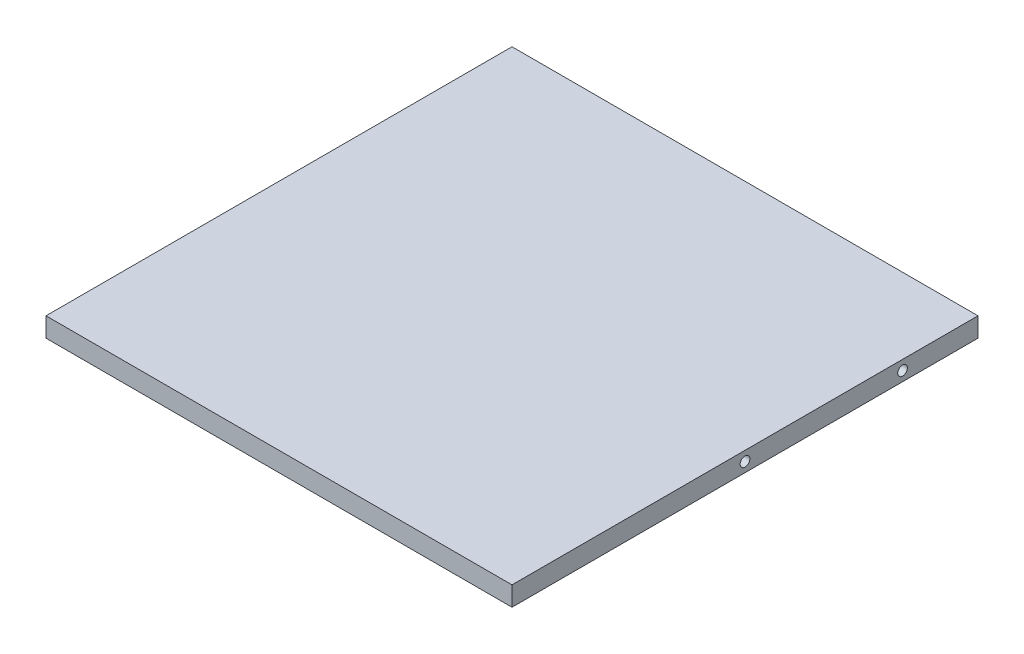
ISO-10303-21;
HEADER;
FILE_DESCRIPTION(('STEP AP214'),'2;1');
FILE_NAME('part.step','',(''),(''),'','','');
FILE_SCHEMA(('AUTOMOTIVE_DESIGN { 1 0 10303 214 1 1 1 1 }'));
ENDSEC;
DATA;
#1=APPLICATION_CONTEXT('core data for automotive mechanical design processes');
#2=APPLICATION_PROTOCOL_DEFINITION('international standard','automotive_design',2000,#1);
#3=PRODUCT_CONTEXT('',#1,'mechanical');
#4=PRODUCT('Part','Part','',(#3));
#5=PRODUCT_RELATED_PRODUCT_CATEGORY('part','',(#4));
#6=PRODUCT_DEFINITION_FORMATION('','',#4);
#7=PRODUCT_DEFINITION_CONTEXT('part definition',#1,'design');
#8=PRODUCT_DEFINITION('design','',#6,#7);
#9=PRODUCT_DEFINITION_SHAPE('','',#8);
#10=(LENGTH_UNIT() NAMED_UNIT(*) SI_UNIT(.MILLI.,.METRE.));
#11=(NAMED_UNIT(*) PLANE_ANGLE_UNIT() SI_UNIT($,.RADIAN.));
#12=(NAMED_UNIT(*) SI_UNIT($,.STERADIAN.) SOLID_ANGLE_UNIT());
#13=UNCERTAINTY_MEASURE_WITH_UNIT(LENGTH_MEASURE(1.E-05),#10,'distance_accuracy_value','');
#14=(GEOMETRIC_REPRESENTATION_CONTEXT(3) GLOBAL_UNCERTAINTY_ASSIGNED_CONTEXT((#13)) GLOBAL_UNIT_ASSIGNED_CONTEXT((#10,
#11,#12)) REPRESENTATION_CONTEXT('',''));
#15=CARTESIAN_POINT('',(0.,0.,0.));
#16=DIRECTION('',(0.,0.,1.));
#17=DIRECTION('',(1.,0.,0.));
#18=AXIS2_PLACEMENT_3D('',#15,#16,#17);
#19=CARTESIAN_POINT('',(-250.84019138756,12.7,-154.952153110048));
#20=DIRECTION('',(1.,0.,0.));
#21=DIRECTION('',(0.,0.,-1.));
#22=AXIS2_PLACEMENT_3D('',#19,#20,#21);
#23=PLANE('',#22);
#24=CARTESIAN_POINT('',(-250.84019138756,6.35,-105.600481839195));
#25=DIRECTION('',(-1.,0.,0.));
#26=DIRECTION('',(0.,0.,1.));
#27=AXIS2_PLACEMENT_3D('',#24,#25,#26);
#28=CIRCLE('',#27,3.175);
#29=CARTESIAN_POINT('',(-250.84019138756,6.35,-102.425481839195));
#30=VERTEX_POINT('',#29);
#31=EDGE_CURVE('E116',#30,#30,#28,.T.);
#32=ORIENTED_EDGE('',*,*,#31,.F.);
#33=EDGE_LOOP('',(#32));
#34=FACE_BOUND('',#33,.T.);
#35=CARTESIAN_POINT('',(-250.84019138756,6.35,-2.55215311004778));
#36=DIRECTION('',(1.,0.,0.));
#37=DIRECTION('',(0.,0.,-1.));
#38=AXIS2_PLACEMENT_3D('',#35,#36,#37);
#39=CIRCLE('',#38,3.175);
#40=CARTESIAN_POINT('',(-250.84019138756,6.35,-5.72715311004778));
#41=VERTEX_POINT('',#40);
#42=EDGE_CURVE('E99',#41,#41,#39,.T.);
#43=ORIENTED_EDGE('',*,*,#42,.T.);
#44=EDGE_LOOP('',(#43));
#45=FACE_BOUND('',#44,.T.);
#46=DIRECTION('',(0.,0.,1.));
#47=VECTOR('',#46,1.);
#48=CARTESIAN_POINT('',(-250.84019138756,0.,-154.952153110048));
#49=LINE('',#48,#47);
#50=CARTESIAN_POINT('',(-250.84019138756,0.,-154.952153110048));
#51=VERTEX_POINT('',#50);
#52=CARTESIAN_POINT('',(-250.84019138756,0.,149.847846889952));
#53=VERTEX_POINT('',#52);
#54=EDGE_CURVE('E96',#51,#53,#49,.T.);
#55=ORIENTED_EDGE('',*,*,#54,.T.);
#56=DIRECTION('',(0.,-1.,0.));
#57=VECTOR('',#56,1.);
#58=CARTESIAN_POINT('',(-250.84019138756,12.7,149.847846889952));
#59=LINE('',#58,#57);
#60=CARTESIAN_POINT('',(-250.84019138756,12.7,149.847846889952));
#61=VERTEX_POINT('',#60);
#62=EDGE_CURVE('E11',#61,#53,#59,.T.);
#63=ORIENTED_EDGE('',*,*,#62,.F.);
#64=DIRECTION('',(0.,0.,1.));
#65=VECTOR('',#64,1.);
#66=CARTESIAN_POINT('',(-250.84019138756,12.7,-154.952153110048));
#67=LINE('',#66,#65);
#68=CARTESIAN_POINT('',(-250.84019138756,12.7,-154.952153110048));
#69=VERTEX_POINT('',#68);
#70=EDGE_CURVE('E84',#69,#61,#67,.T.);
#71=ORIENTED_EDGE('',*,*,#70,.F.);
#72=DIRECTION('',(0.,-1.,0.));
#73=VECTOR('',#72,1.);
#74=CARTESIAN_POINT('',(-250.84019138756,12.7,-154.952153110048));
#75=LINE('',#74,#73);
#76=EDGE_CURVE('E92',#69,#51,#75,.T.);
#77=ORIENTED_EDGE('',*,*,#76,.T.);
#78=EDGE_LOOP('',(#55,#63,#71,#77));
#79=FACE_BOUND('',#78,.T.);
#80=ADVANCED_FACE('F33',(#34,#45,#79),#23,.F.);
#81=CARTESIAN_POINT('',(-250.84019138756,12.7,149.847846889952));
#82=DIRECTION('',(0.,0.,-1.));
#83=DIRECTION('',(-1.,0.,0.));
#84=AXIS2_PLACEMENT_3D('',#81,#82,#83);
#85=PLANE('',#84);
#86=DIRECTION('',(1.,0.,0.));
#87=VECTOR('',#86,1.);
#88=CARTESIAN_POINT('',(-250.84019138756,0.,149.847846889952));
#89=LINE('',#88,#87);
#90=CARTESIAN_POINT('',(53.9598086124403,0.,149.847846889952));
#91=VERTEX_POINT('',#90);
#92=EDGE_CURVE('E88',#53,#91,#89,.T.);
#93=ORIENTED_EDGE('',*,*,#92,.T.);
#94=DIRECTION('',(0.,-1.,0.));
#95=VECTOR('',#94,1.);
#96=CARTESIAN_POINT('',(53.9598086124403,12.7,149.847846889952));
#97=LINE('',#96,#95);
#98=CARTESIAN_POINT('',(53.9598086124403,12.7,149.847846889952));
#99=VERTEX_POINT('',#98);
#100=EDGE_CURVE('E41',#99,#91,#97,.T.);
#101=ORIENTED_EDGE('',*,*,#100,.F.);
#102=DIRECTION('',(1.,0.,0.));
#103=VECTOR('',#102,1.);
#104=CARTESIAN_POINT('',(-250.84019138756,12.7,149.847846889952));
#105=LINE('',#104,#103);
#106=EDGE_CURVE('E79',#61,#99,#105,.T.);
#107=ORIENTED_EDGE('',*,*,#106,.F.);
#108=ORIENTED_EDGE('',*,*,#62,.T.);
#109=EDGE_LOOP('',(#93,#101,#107,#108));
#110=FACE_BOUND('',#109,.T.);
#111=ADVANCED_FACE('F87',(#110),#85,.F.);
#112=CARTESIAN_POINT('',(53.9598086124403,12.7,-154.952153110048));
#113=DIRECTION('',(-1.,0.,0.));
#114=DIRECTION('',(0.,0.,1.));
#115=AXIS2_PLACEMENT_3D('',#112,#113,#114);
#116=PLANE('',#115);
#117=CARTESIAN_POINT('',(53.9598086124403,6.35,-105.600481839195));
#118=DIRECTION('',(-1.,0.,0.));
#119=DIRECTION('',(0.,0.,1.));
#120=AXIS2_PLACEMENT_3D('',#117,#118,#119);
#121=CIRCLE('',#120,3.175);
#122=CARTESIAN_POINT('',(53.9598086124403,6.35,-102.425481839195));
#123=VERTEX_POINT('',#122);
#124=EDGE_CURVE('E113',#123,#123,#121,.T.);
#125=ORIENTED_EDGE('',*,*,#124,.T.);
#126=EDGE_LOOP('',(#125));
#127=FACE_BOUND('',#126,.T.);
#128=CARTESIAN_POINT('',(53.9598086124403,6.35,-2.55215311004778));
#129=DIRECTION('',(1.,0.,0.));
#130=DIRECTION('',(0.,0.,-1.));
#131=AXIS2_PLACEMENT_3D('',#128,#129,#130);
#132=CIRCLE('',#131,3.175);
#133=CARTESIAN_POINT('',(53.9598086124403,6.35,-5.72715311004778));
#134=VERTEX_POINT('',#133);
#135=EDGE_CURVE('E110',#134,#134,#132,.T.);
#136=ORIENTED_EDGE('',*,*,#135,.F.);
#137=EDGE_LOOP('',(#136));
#138=FACE_BOUND('',#137,.T.);
#139=DIRECTION('',(0.,0.,-1.));
#140=VECTOR('',#139,1.);
#141=CARTESIAN_POINT('',(53.9598086124403,0.,-154.952153110048));
#142=LINE('',#141,#140);
#143=CARTESIAN_POINT('',(53.9598086124403,0.,-154.952153110048));
#144=VERTEX_POINT('',#143);
#145=EDGE_CURVE('E66',#91,#144,#142,.T.);
#146=ORIENTED_EDGE('',*,*,#145,.T.);
#147=DIRECTION('',(0.,-1.,0.));
#148=VECTOR('',#147,1.);
#149=CARTESIAN_POINT('',(53.9598086124403,12.7,-154.952153110048));
#150=LINE('',#149,#148);
#151=CARTESIAN_POINT('',(53.9598086124403,12.7,-154.952153110048));
#152=VERTEX_POINT('',#151);
#153=EDGE_CURVE('E89',#152,#144,#150,.T.);
#154=ORIENTED_EDGE('',*,*,#153,.F.);
#155=DIRECTION('',(0.,0.,-1.));
#156=VECTOR('',#155,1.);
#157=CARTESIAN_POINT('',(53.9598086124403,12.7,-154.952153110048));
#158=LINE('',#157,#156);
#159=EDGE_CURVE('E82',#99,#152,#158,.T.);
#160=ORIENTED_EDGE('',*,*,#159,.F.);
#161=ORIENTED_EDGE('',*,*,#100,.T.);
#162=EDGE_LOOP('',(#146,#154,#160,#161));
#163=FACE_BOUND('',#162,.T.);
#164=ADVANCED_FACE('F90',(#127,#138,#163),#116,.F.);
#165=CARTESIAN_POINT('',(-250.84019138756,12.7,-154.952153110048));
#166=DIRECTION('',(0.,0.,1.));
#167=DIRECTION('',(1.,0.,0.));
#168=AXIS2_PLACEMENT_3D('',#165,#166,#167);
#169=PLANE('',#168);
#170=DIRECTION('',(-1.,0.,0.));
#171=VECTOR('',#170,1.);
#172=CARTESIAN_POINT('',(-250.84019138756,0.,-154.952153110048));
#173=LINE('',#172,#171);
#174=EDGE_CURVE('E72',#144,#51,#173,.T.);
#175=ORIENTED_EDGE('',*,*,#174,.T.);
#176=ORIENTED_EDGE('',*,*,#76,.F.);
#177=DIRECTION('',(-1.,0.,0.));
#178=VECTOR('',#177,1.);
#179=CARTESIAN_POINT('',(-250.84019138756,12.7,-154.952153110048));
#180=LINE('',#179,#178);
#181=EDGE_CURVE('E49',#152,#69,#180,.T.);
#182=ORIENTED_EDGE('',*,*,#181,.F.);
#183=ORIENTED_EDGE('',*,*,#153,.T.);
#184=EDGE_LOOP('',(#175,#176,#182,#183));
#185=FACE_BOUND('',#184,.T.);
#186=ADVANCED_FACE('F104',(#185),#169,.F.);
#187=CARTESIAN_POINT('',(0.,12.7,0.));
#188=DIRECTION('',(0.,1.,0.));
#189=DIRECTION('',(0.,0.,1.));
#190=AXIS2_PLACEMENT_3D('',#187,#188,#189);
#191=PLANE('',#190);
#192=ORIENTED_EDGE('',*,*,#70,.T.);
#193=ORIENTED_EDGE('',*,*,#106,.T.);
#194=ORIENTED_EDGE('',*,*,#159,.T.);
#195=ORIENTED_EDGE('',*,*,#181,.T.);
#196=EDGE_LOOP('',(#192,#193,#194,#195));
#197=FACE_BOUND('',#196,.T.);
#198=ADVANCED_FACE('F80',(#197),#191,.T.);
#199=CARTESIAN_POINT('',(0.,0.,0.));
#200=DIRECTION('',(0.,1.,0.));
#201=DIRECTION('',(0.,0.,1.));
#202=AXIS2_PLACEMENT_3D('',#199,#200,#201);
#203=PLANE('',#202);
#204=ORIENTED_EDGE('',*,*,#54,.F.);
#205=ORIENTED_EDGE('',*,*,#174,.F.);
#206=ORIENTED_EDGE('',*,*,#145,.F.);
#207=ORIENTED_EDGE('',*,*,#92,.F.);
#208=EDGE_LOOP('',(#204,#205,#206,#207));
#209=FACE_BOUND('',#208,.T.);
#210=ADVANCED_FACE('F107',(#209),#203,.F.);
#211=CARTESIAN_POINT('',(-250.84019138756,6.35,-2.55215311004778));
#212=DIRECTION('',(1.,0.,0.));
#213=DIRECTION('',(0.,0.,-1.));
#214=AXIS2_PLACEMENT_3D('',#211,#212,#213);
#215=CYLINDRICAL_SURFACE('',#214,3.175);
#216=CARTESIAN_POINT('',(-250.84019138756,6.35,-5.72715311004778));
#217=CARTESIAN_POINT('',(-247.66519138756,6.35,-5.72715311004778));
#218=CARTESIAN_POINT('',(-244.49019138756,6.35,-5.72715311004778));
#219=CARTESIAN_POINT('',(-238.14019138756,6.35,-5.72715311004778));
#220=CARTESIAN_POINT('',(-234.96519138756,6.35,-5.72715311004778));
#221=CARTESIAN_POINT('',(-228.61519138756,6.35,-5.72715311004778));
#222=CARTESIAN_POINT('',(-225.44019138756,6.35,-5.72715311004778));
#223=CARTESIAN_POINT('',(-219.09019138756,6.35,-5.72715311004778));
#224=CARTESIAN_POINT('',(-215.91519138756,6.35,-5.72715311004778));
#225=CARTESIAN_POINT('',(-209.56519138756,6.35,-5.72715311004778));
#226=CARTESIAN_POINT('',(-206.39019138756,6.35,-5.72715311004778));
#227=CARTESIAN_POINT('',(-200.04019138756,6.35,-5.72715311004778));
#228=CARTESIAN_POINT('',(-196.86519138756,6.35,-5.72715311004778));
#229=CARTESIAN_POINT('',(-190.51519138756,6.35,-5.72715311004778));
#230=CARTESIAN_POINT('',(-187.34019138756,6.35,-5.72715311004778));
#231=CARTESIAN_POINT('',(-180.99019138756,6.35,-5.72715311004778));
#232=CARTESIAN_POINT('',(-177.81519138756,6.35,-5.72715311004778));
#233=CARTESIAN_POINT('',(-171.46519138756,6.35,-5.72715311004778));
#234=CARTESIAN_POINT('',(-168.29019138756,6.35,-5.72715311004778));
#235=CARTESIAN_POINT('',(-161.94019138756,6.35,-5.72715311004778));
#236=CARTESIAN_POINT('',(-158.76519138756,6.35,-5.72715311004778));
#237=CARTESIAN_POINT('',(-152.41519138756,6.35,-5.72715311004778));
#238=CARTESIAN_POINT('',(-149.24019138756,6.35,-5.72715311004778));
#239=CARTESIAN_POINT('',(-142.89019138756,6.35,-5.72715311004778));
#240=CARTESIAN_POINT('',(-139.71519138756,6.35,-5.72715311004778));
#241=CARTESIAN_POINT('',(-133.36519138756,6.35,-5.72715311004778));
#242=CARTESIAN_POINT('',(-130.19019138756,6.35,-5.72715311004778));
#243=CARTESIAN_POINT('',(-123.84019138756,6.35,-5.72715311004778));
#244=CARTESIAN_POINT('',(-120.66519138756,6.35,-5.72715311004778));
#245=CARTESIAN_POINT('',(-114.31519138756,6.35,-5.72715311004778));
#246=CARTESIAN_POINT('',(-111.14019138756,6.35,-5.72715311004778));
#247=CARTESIAN_POINT('',(-104.79019138756,6.35,-5.72715311004778));
#248=CARTESIAN_POINT('',(-101.61519138756,6.35,-5.72715311004778));
#249=CARTESIAN_POINT('',(-95.2651913875598,6.35,-5.72715311004778));
#250=CARTESIAN_POINT('',(-92.0901913875598,6.35,-5.72715311004778));
#251=CARTESIAN_POINT('',(-85.7401913875598,6.35,-5.72715311004778));
#252=CARTESIAN_POINT('',(-82.5651913875598,6.35,-5.72715311004778));
#253=CARTESIAN_POINT('',(-76.2151913875598,6.35,-5.72715311004778));
#254=CARTESIAN_POINT('',(-73.0401913875598,6.35,-5.72715311004778));
#255=CARTESIAN_POINT('',(-66.6901913875598,6.35,-5.72715311004778));
#256=CARTESIAN_POINT('',(-63.5151913875597,6.35,-5.72715311004778));
#257=CARTESIAN_POINT('',(-57.1651913875598,6.35,-5.72715311004778));
#258=CARTESIAN_POINT('',(-53.9901913875598,6.35,-5.72715311004778));
#259=CARTESIAN_POINT('',(-47.6401913875598,6.35,-5.72715311004778));
#260=CARTESIAN_POINT('',(-44.4651913875598,6.35,-5.72715311004778));
#261=CARTESIAN_POINT('',(-38.1151913875598,6.35,-5.72715311004778));
#262=CARTESIAN_POINT('',(-34.9401913875598,6.35,-5.72715311004778));
#263=CARTESIAN_POINT('',(-28.5901913875598,6.35,-5.72715311004778));
#264=CARTESIAN_POINT('',(-25.4151913875598,6.35,-5.72715311004778));
#265=CARTESIAN_POINT('',(-19.0651913875598,6.35,-5.72715311004778));
#266=CARTESIAN_POINT('',(-15.8901913875597,6.35,-5.72715311004778));
#267=CARTESIAN_POINT('',(-9.54019138755975,6.35,-5.72715311004778));
#268=CARTESIAN_POINT('',(-6.36519138755975,6.35,-5.72715311004778));
#269=CARTESIAN_POINT('',(-0.0151913875597507,6.35,-5.72715311004778));
#270=CARTESIAN_POINT('',(3.15980861244024,6.35,-5.72715311004778));
#271=CARTESIAN_POINT('',(9.50980861244024,6.35,-5.72715311004778));
#272=CARTESIAN_POINT('',(12.6848086124402,6.35,-5.72715311004778));
#273=CARTESIAN_POINT('',(19.0348086124402,6.35,-5.72715311004778));
#274=CARTESIAN_POINT('',(22.2098086124402,6.35,-5.72715311004778));
#275=CARTESIAN_POINT('',(28.5598086124402,6.35,-5.72715311004778));
#276=CARTESIAN_POINT('',(31.7348086124402,6.35,-5.72715311004778));
#277=CARTESIAN_POINT('',(38.0848086124403,6.35,-5.72715311004778));
#278=CARTESIAN_POINT('',(41.2598086124403,6.35,-5.72715311004778));
#279=CARTESIAN_POINT('',(47.6098086124403,6.35,-5.72715311004778));
#280=CARTESIAN_POINT('',(50.7848086124403,6.35,-5.72715311004778));
#281=CARTESIAN_POINT('',(53.9598086124403,6.35,-5.72715311004778));
#282=B_SPLINE_CURVE_WITH_KNOTS('',3,(#216,#217,#218,#219,#220,#221,#222,#223,#224,#225,#226,
#227,#228,#229,#230,#231,#232,#233,#234,#235,#236,#237,#238,#239,#240,#241,#242,#243,#244,#245,
#246,#247,#248,#249,#250,#251,#252,#253,#254,#255,#256,#257,#258,#259,#260,#261,#262,#263,#264,
#265,#266,#267,#268,#269,#270,#271,#272,#273,#274,#275,#276,#277,#278,#279,#280,#281),
.UNSPECIFIED.,.F.,.F.,(4,2,2,2,2,2,2,2,2,2,2,2,2,2,2,2,2,2,2,2,2,2,2,2,2,2,2,2,2,2,2,2,4),(0.,
9.52499999999998,19.05,28.575,38.1,47.625,57.15,66.675,76.2,85.725,95.25,104.775,114.3,123.825,
133.35,142.875,152.4,161.925,171.45,180.975,190.5,200.025,209.55,219.075,228.6,238.125,247.65,
257.175,266.7,276.225,285.75,295.275,304.8),.UNSPECIFIED.);
#283=EDGE_CURVE('BSEAM127',#41,#134,#282,.T.);
#284=ORIENTED_EDGE('',*,*,#42,.F.);
#285=ORIENTED_EDGE('',*,*,#135,.T.);
#286=ORIENTED_EDGE('',*,*,#283,.T.);
#287=ORIENTED_EDGE('',*,*,#283,.F.);
#288=EDGE_LOOP('',(#284,#286,#285,#287));
#289=FACE_BOUND('',#288,.T.);
#290=ADVANCED_FACE('F127',(#289),#215,.F.);
#291=CARTESIAN_POINT('',(53.9598086124403,6.35,-105.600481839195));
#292=DIRECTION('',(-1.,0.,0.));
#293=DIRECTION('',(0.,0.,1.));
#294=AXIS2_PLACEMENT_3D('',#291,#292,#293);
#295=CYLINDRICAL_SURFACE('',#294,3.175);
#296=CARTESIAN_POINT('',(53.9598086124403,6.35,-102.425481839195));
#297=CARTESIAN_POINT('',(50.7848086124403,6.35,-102.425481839195));
#298=CARTESIAN_POINT('',(47.6098086124403,6.35,-102.425481839195));
#299=CARTESIAN_POINT('',(41.2598086124403,6.35,-102.425481839195));
#300=CARTESIAN_POINT('',(38.0848086124403,6.35,-102.425481839195));
#301=CARTESIAN_POINT('',(31.7348086124403,6.35,-102.425481839195));
#302=CARTESIAN_POINT('',(28.5598086124403,6.35,-102.425481839195));
#303=CARTESIAN_POINT('',(22.2098086124403,6.35,-102.425481839195));
#304=CARTESIAN_POINT('',(19.0348086124403,6.35,-102.425481839195));
#305=CARTESIAN_POINT('',(12.6848086124403,6.35,-102.425481839195));
#306=CARTESIAN_POINT('',(9.50980861244026,6.35,-102.425481839195));
#307=CARTESIAN_POINT('',(3.15980861244026,6.35,-102.425481839195));
#308=CARTESIAN_POINT('',(-0.0151913875597437,6.35,-102.425481839195));
#309=CARTESIAN_POINT('',(-6.36519138755974,6.35,-102.425481839195));
#310=CARTESIAN_POINT('',(-9.54019138755974,6.35,-102.425481839195));
#311=CARTESIAN_POINT('',(-15.8901913875597,6.35,-102.425481839195));
#312=CARTESIAN_POINT('',(-19.0651913875597,6.35,-102.425481839195));
#313=CARTESIAN_POINT('',(-25.4151913875597,6.35,-102.425481839195));
#314=CARTESIAN_POINT('',(-28.5901913875597,6.35,-102.425481839195));
#315=CARTESIAN_POINT('',(-34.9401913875598,6.35,-102.425481839195));
#316=CARTESIAN_POINT('',(-38.1151913875597,6.35,-102.425481839195));
#317=CARTESIAN_POINT('',(-44.4651913875597,6.35,-102.425481839195));
#318=CARTESIAN_POINT('',(-47.6401913875597,6.35,-102.425481839195));
#319=CARTESIAN_POINT('',(-53.9901913875597,6.35,-102.425481839195));
#320=CARTESIAN_POINT('',(-57.1651913875597,6.35,-102.425481839195));
#321=CARTESIAN_POINT('',(-63.5151913875597,6.35,-102.425481839195));
#322=CARTESIAN_POINT('',(-66.6901913875598,6.35,-102.425481839195));
#323=CARTESIAN_POINT('',(-73.0401913875598,6.35,-102.425481839195));
#324=CARTESIAN_POINT('',(-76.2151913875597,6.35,-102.425481839195));
#325=CARTESIAN_POINT('',(-82.5651913875597,6.35,-102.425481839195));
#326=CARTESIAN_POINT('',(-85.7401913875597,6.35,-102.425481839195));
#327=CARTESIAN_POINT('',(-92.0901913875597,6.35,-102.425481839195));
#328=CARTESIAN_POINT('',(-95.2651913875598,6.35,-102.425481839195));
#329=CARTESIAN_POINT('',(-101.61519138756,6.35,-102.425481839195));
#330=CARTESIAN_POINT('',(-104.79019138756,6.35,-102.425481839195));
#331=CARTESIAN_POINT('',(-111.14019138756,6.35,-102.425481839195));
#332=CARTESIAN_POINT('',(-114.31519138756,6.35,-102.425481839195));
#333=CARTESIAN_POINT('',(-120.66519138756,6.35,-102.425481839195));
#334=CARTESIAN_POINT('',(-123.84019138756,6.35,-102.425481839195));
#335=CARTESIAN_POINT('',(-130.19019138756,6.35,-102.425481839195));
#336=CARTESIAN_POINT('',(-133.36519138756,6.35,-102.425481839195));
#337=CARTESIAN_POINT('',(-139.71519138756,6.35,-102.425481839195));
#338=CARTESIAN_POINT('',(-142.89019138756,6.35,-102.425481839195));
#339=CARTESIAN_POINT('',(-149.24019138756,6.35,-102.425481839195));
#340=CARTESIAN_POINT('',(-152.41519138756,6.35,-102.425481839195));
#341=CARTESIAN_POINT('',(-158.76519138756,6.35,-102.425481839195));
#342=CARTESIAN_POINT('',(-161.94019138756,6.35,-102.425481839195));
#343=CARTESIAN_POINT('',(-168.29019138756,6.35,-102.425481839195));
#344=CARTESIAN_POINT('',(-171.46519138756,6.35,-102.425481839195));
#345=CARTESIAN_POINT('',(-177.81519138756,6.35,-102.425481839195));
#346=CARTESIAN_POINT('',(-180.99019138756,6.35,-102.425481839195));
#347=CARTESIAN_POINT('',(-187.34019138756,6.35,-102.425481839195));
#348=CARTESIAN_POINT('',(-190.51519138756,6.35,-102.425481839195));
#349=CARTESIAN_POINT('',(-196.86519138756,6.35,-102.425481839195));
#350=CARTESIAN_POINT('',(-200.04019138756,6.35,-102.425481839195));
#351=CARTESIAN_POINT('',(-206.39019138756,6.35,-102.425481839195));
#352=CARTESIAN_POINT('',(-209.56519138756,6.35,-102.425481839195));
#353=CARTESIAN_POINT('',(-215.91519138756,6.35,-102.425481839195));
#354=CARTESIAN_POINT('',(-219.09019138756,6.35,-102.425481839195));
#355=CARTESIAN_POINT('',(-225.44019138756,6.35,-102.425481839195));
#356=CARTESIAN_POINT('',(-228.61519138756,6.35,-102.425481839195));
#357=CARTESIAN_POINT('',(-234.96519138756,6.35,-102.425481839195));
#358=CARTESIAN_POINT('',(-238.14019138756,6.35,-102.425481839195));
#359=CARTESIAN_POINT('',(-244.49019138756,6.35,-102.425481839195));
#360=CARTESIAN_POINT('',(-247.66519138756,6.35,-102.425481839195));
#361=CARTESIAN_POINT('',(-250.84019138756,6.35,-102.425481839195));
#362=B_SPLINE_CURVE_WITH_KNOTS('',3,(#296,#297,#298,#299,#300,#301,#302,#303,#304,#305,#306,
#307,#308,#309,#310,#311,#312,#313,#314,#315,#316,#317,#318,#319,#320,#321,#322,#323,#324,#325,
#326,#327,#328,#329,#330,#331,#332,#333,#334,#335,#336,#337,#338,#339,#340,#341,#342,#343,#344,
#345,#346,#347,#348,#349,#350,#351,#352,#353,#354,#355,#356,#357,#358,#359,#360,#361),
.UNSPECIFIED.,.F.,.F.,(4,2,2,2,2,2,2,2,2,2,2,2,2,2,2,2,2,2,2,2,2,2,2,2,2,2,2,2,2,2,2,2,4),(0.,
9.525,19.05,28.575,38.1,47.625,57.15,66.675,76.2,85.725,95.25,104.775,114.3,123.825,133.35,
142.875,152.4,161.925,171.45,180.975,190.5,200.025,209.55,219.075,228.6,238.125,247.65,257.175,
266.7,276.225,285.75,295.275,304.8),.UNSPECIFIED.);
#363=EDGE_CURVE('BSEAM124',#123,#30,#362,.T.);
#364=ORIENTED_EDGE('',*,*,#124,.F.);
#365=ORIENTED_EDGE('',*,*,#31,.T.);
#366=ORIENTED_EDGE('',*,*,#363,.T.);
#367=ORIENTED_EDGE('',*,*,#363,.F.);
#368=EDGE_LOOP('',(#364,#366,#365,#367));
#369=FACE_BOUND('',#368,.T.);
#370=ADVANCED_FACE('F124',(#369),#295,.F.);
#371=CLOSED_SHELL('',(#80,#111,#164,#186,#198,#210,#290,#370));
#372=MANIFOLD_SOLID_BREP('B2',#371);
#373=ADVANCED_BREP_SHAPE_REPRESENTATION('',(#18,#372),#14);
#374=SHAPE_DEFINITION_REPRESENTATION(#9,#373);
ENDSEC;
END-ISO-10303-21;
